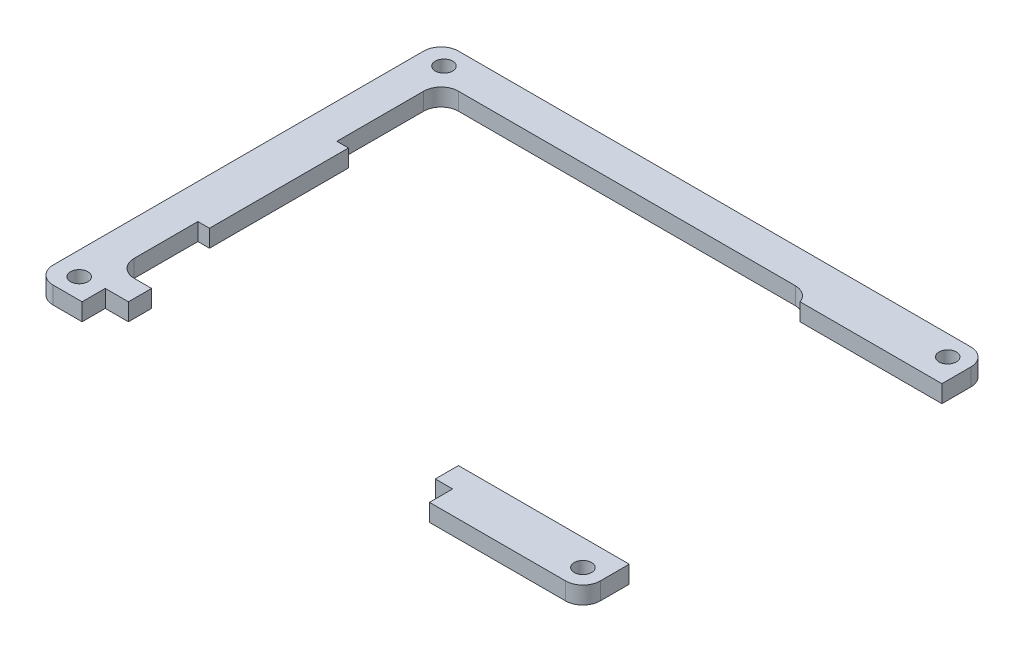
ISO-10303-21;
HEADER;
FILE_DESCRIPTION(('STEP AP214'),'2;1');
FILE_NAME('part.step','',(''),(''),'','','');
FILE_SCHEMA(('AUTOMOTIVE_DESIGN { 1 0 10303 214 1 1 1 1 }'));
ENDSEC;
DATA;
#1=APPLICATION_CONTEXT('core data for automotive mechanical design processes');
#2=APPLICATION_PROTOCOL_DEFINITION('international standard','automotive_design',2000,#1);
#3=PRODUCT_CONTEXT('',#1,'mechanical');
#4=PRODUCT('Part','Part','',(#3));
#5=PRODUCT_RELATED_PRODUCT_CATEGORY('part','',(#4));
#6=PRODUCT_DEFINITION_FORMATION('','',#4);
#7=PRODUCT_DEFINITION_CONTEXT('part definition',#1,'design');
#8=PRODUCT_DEFINITION('design','',#6,#7);
#9=PRODUCT_DEFINITION_SHAPE('','',#8);
#10=(LENGTH_UNIT() NAMED_UNIT(*) SI_UNIT(.MILLI.,.METRE.));
#11=(NAMED_UNIT(*) PLANE_ANGLE_UNIT() SI_UNIT($,.RADIAN.));
#12=(NAMED_UNIT(*) SI_UNIT($,.STERADIAN.) SOLID_ANGLE_UNIT());
#13=UNCERTAINTY_MEASURE_WITH_UNIT(LENGTH_MEASURE(1.E-05),#10,'distance_accuracy_value','');
#14=(GEOMETRIC_REPRESENTATION_CONTEXT(3) GLOBAL_UNCERTAINTY_ASSIGNED_CONTEXT((#13)) GLOBAL_UNIT_ASSIGNED_CONTEXT((#10,
#11,#12)) REPRESENTATION_CONTEXT('',''));
#15=CARTESIAN_POINT('',(0.,0.,0.));
#16=DIRECTION('',(0.,0.,1.));
#17=DIRECTION('',(1.,0.,0.));
#18=AXIS2_PLACEMENT_3D('',#15,#16,#17);
#19=CARTESIAN_POINT('',(47.25,3.,-35.));
#20=DIRECTION('',(-1.,0.,0.));
#21=DIRECTION('',(0.,0.,1.));
#22=AXIS2_PLACEMENT_3D('',#19,#20,#21);
#23=PLANE('',#22);
#24=DIRECTION('',(0.,1.,0.));
#25=VECTOR('',#24,1.);
#26=CARTESIAN_POINT('',(47.25,0.,27.));
#27=LINE('',#26,#25);
#28=CARTESIAN_POINT('',(47.25,0.,27.));
#29=VERTEX_POINT('',#28);
#30=CARTESIAN_POINT('',(47.25,3.,27.));
#31=VERTEX_POINT('',#30);
#32=EDGE_CURVE('E129',#29,#31,#27,.T.);
#33=ORIENTED_EDGE('',*,*,#32,.T.);
#34=DIRECTION('',(0.,0.,-1.));
#35=VECTOR('',#34,1.);
#36=CARTESIAN_POINT('',(47.25,3.,-35.));
#37=LINE('',#36,#35);
#38=CARTESIAN_POINT('',(47.25,3.,32.));
#39=VERTEX_POINT('',#38);
#40=EDGE_CURVE('E114',#39,#31,#37,.T.);
#41=ORIENTED_EDGE('',*,*,#40,.F.);
#42=DIRECTION('',(0.,-1.,0.));
#43=VECTOR('',#42,1.);
#44=CARTESIAN_POINT('',(47.25,3.,32.));
#45=LINE('',#44,#43);
#46=CARTESIAN_POINT('',(47.25,0.,32.));
#47=VERTEX_POINT('',#46);
#48=EDGE_CURVE('E127',#39,#47,#45,.T.);
#49=ORIENTED_EDGE('',*,*,#48,.T.);
#50=DIRECTION('',(0.,0.,-1.));
#51=VECTOR('',#50,1.);
#52=CARTESIAN_POINT('',(47.25,0.,-35.));
#53=LINE('',#52,#51);
#54=EDGE_CURVE('E135',#47,#29,#53,.T.);
#55=ORIENTED_EDGE('',*,*,#54,.T.);
#56=EDGE_LOOP('',(#33,#41,#49,#55));
#57=FACE_BOUND('',#56,.T.);
#58=ADVANCED_FACE('F49',(#57),#23,.F.);
#59=CARTESIAN_POINT('',(-47.25,3.,35.));
#60=DIRECTION('',(0.,0.,-1.));
#61=DIRECTION('',(-1.,0.,0.));
#62=AXIS2_PLACEMENT_3D('',#59,#60,#61);
#63=PLANE('',#62);
#64=DIRECTION('',(1.,0.,0.));
#65=VECTOR('',#64,1.);
#66=CARTESIAN_POINT('',(-47.25,3.,35.));
#67=LINE('',#66,#65);
#68=CARTESIAN_POINT('',(20.75,3.,35.));
#69=VERTEX_POINT('',#68);
#70=CARTESIAN_POINT('',(44.25,3.,35.));
#71=VERTEX_POINT('',#70);
#72=EDGE_CURVE('E116',#69,#71,#67,.T.);
#73=ORIENTED_EDGE('',*,*,#72,.F.);
#74=DIRECTION('',(0.,1.,0.));
#75=VECTOR('',#74,1.);
#76=CARTESIAN_POINT('',(20.75,0.,35.));
#77=LINE('',#76,#75);
#78=CARTESIAN_POINT('',(20.75,0.,35.));
#79=VERTEX_POINT('',#78);
#80=EDGE_CURVE('E12',#79,#69,#77,.T.);
#81=ORIENTED_EDGE('',*,*,#80,.F.);
#82=DIRECTION('',(1.,0.,0.));
#83=VECTOR('',#82,1.);
#84=CARTESIAN_POINT('',(-47.25,0.,35.));
#85=LINE('',#84,#83);
#86=CARTESIAN_POINT('',(44.25,0.,35.));
#87=VERTEX_POINT('',#86);
#88=EDGE_CURVE('E137',#79,#87,#85,.T.);
#89=ORIENTED_EDGE('',*,*,#88,.T.);
#90=DIRECTION('',(0.,-1.,0.));
#91=VECTOR('',#90,1.);
#92=CARTESIAN_POINT('',(44.25,3.,35.));
#93=LINE('',#92,#91);
#94=EDGE_CURVE('E130',#87,#71,#93,.F.);
#95=ORIENTED_EDGE('',*,*,#94,.T.);
#96=EDGE_LOOP('',(#73,#81,#89,#95));
#97=FACE_BOUND('',#96,.T.);
#98=ADVANCED_FACE('F183',(#97),#63,.F.);
#99=CARTESIAN_POINT('',(0.,3.,0.));
#100=DIRECTION('',(0.,1.,0.));
#101=DIRECTION('',(0.,0.,1.));
#102=AXIS2_PLACEMENT_3D('',#99,#100,#101);
#103=PLANE('',#102);
#104=CARTESIAN_POINT('',(43.75,3.,31.5));
#105=DIRECTION('',(0.,1.,0.));
#106=DIRECTION('',(0.,0.,1.));
#107=AXIS2_PLACEMENT_3D('',#104,#105,#106);
#108=CIRCLE('',#107,1.5);
#109=CARTESIAN_POINT('',(43.75,3.,33.));
#110=VERTEX_POINT('',#109);
#111=EDGE_CURVE('E144',#110,#110,#108,.T.);
#112=ORIENTED_EDGE('',*,*,#111,.F.);
#113=EDGE_LOOP('',(#112));
#114=FACE_BOUND('',#113,.T.);
#115=ORIENTED_EDGE('',*,*,#40,.T.);
#116=DIRECTION('',(-1.,0.,0.));
#117=VECTOR('',#116,1.);
#118=CARTESIAN_POINT('',(0.,3.,27.));
#119=LINE('',#118,#117);
#120=CARTESIAN_POINT('',(17.75,3.,27.));
#121=VERTEX_POINT('',#120);
#122=EDGE_CURVE('E53',#31,#121,#119,.T.);
#123=ORIENTED_EDGE('',*,*,#122,.T.);
#124=DIRECTION('',(0.,0.,-1.));
#125=VECTOR('',#124,1.);
#126=CARTESIAN_POINT('',(17.75,3.,0.));
#127=LINE('',#126,#125);
#128=CARTESIAN_POINT('',(17.75,3.,31.));
#129=VERTEX_POINT('',#128);
#130=EDGE_CURVE('E156',#129,#121,#127,.T.);
#131=ORIENTED_EDGE('',*,*,#130,.F.);
#132=DIRECTION('',(-1.,0.,0.));
#133=VECTOR('',#132,1.);
#134=CARTESIAN_POINT('',(0.,3.,31.));
#135=LINE('',#134,#133);
#136=CARTESIAN_POINT('',(20.75,3.,31.));
#137=VERTEX_POINT('',#136);
#138=EDGE_CURVE('E154',#137,#129,#135,.T.);
#139=ORIENTED_EDGE('',*,*,#138,.F.);
#140=DIRECTION('',(0.,0.,-1.));
#141=VECTOR('',#140,1.);
#142=CARTESIAN_POINT('',(20.75,3.,0.));
#143=LINE('',#142,#141);
#144=EDGE_CURVE('E59',#69,#137,#143,.T.);
#145=ORIENTED_EDGE('',*,*,#144,.F.);
#146=ORIENTED_EDGE('',*,*,#72,.T.);
#147=CARTESIAN_POINT('',(44.25,3.,32.));
#148=DIRECTION('',(0.,1.,0.));
#149=DIRECTION('',(0.,0.,1.));
#150=AXIS2_PLACEMENT_3D('',#147,#148,#149);
#151=CIRCLE('',#150,3.);
#152=EDGE_CURVE('E110',#71,#39,#151,.T.);
#153=ORIENTED_EDGE('',*,*,#152,.T.);
#154=EDGE_LOOP('',(#115,#123,#131,#139,#145,#146,#153));
#155=FACE_BOUND('',#154,.T.);
#156=ADVANCED_FACE('F112',(#114,#155),#103,.T.);
#157=CARTESIAN_POINT('',(0.,0.,0.));
#158=DIRECTION('',(0.,1.,0.));
#159=DIRECTION('',(0.,0.,1.));
#160=AXIS2_PLACEMENT_3D('',#157,#158,#159);
#161=PLANE('',#160);
#162=CARTESIAN_POINT('',(43.75,0.,31.5));
#163=DIRECTION('',(0.,1.,0.));
#164=DIRECTION('',(0.,0.,1.));
#165=AXIS2_PLACEMENT_3D('',#162,#163,#164);
#166=CIRCLE('',#165,1.5);
#167=CARTESIAN_POINT('',(43.75,0.,33.));
#168=VERTEX_POINT('',#167);
#169=EDGE_CURVE('E121',#168,#168,#166,.T.);
#170=ORIENTED_EDGE('',*,*,#169,.T.);
#171=EDGE_LOOP('',(#170));
#172=FACE_BOUND('',#171,.T.);
#173=DIRECTION('',(-1.,0.,0.));
#174=VECTOR('',#173,1.);
#175=CARTESIAN_POINT('',(0.,0.,27.));
#176=LINE('',#175,#174);
#177=CARTESIAN_POINT('',(17.75,0.,27.));
#178=VERTEX_POINT('',#177);
#179=EDGE_CURVE('E147',#29,#178,#176,.T.);
#180=ORIENTED_EDGE('',*,*,#179,.F.);
#181=ORIENTED_EDGE('',*,*,#54,.F.);
#182=CARTESIAN_POINT('',(44.25,0.,32.));
#183=DIRECTION('',(0.,1.,0.));
#184=DIRECTION('',(0.,0.,1.));
#185=AXIS2_PLACEMENT_3D('',#182,#183,#184);
#186=CIRCLE('',#185,3.);
#187=EDGE_CURVE('E134',#47,#87,#186,.F.);
#188=ORIENTED_EDGE('',*,*,#187,.T.);
#189=ORIENTED_EDGE('',*,*,#88,.F.);
#190=DIRECTION('',(0.,0.,-1.));
#191=VECTOR('',#190,1.);
#192=CARTESIAN_POINT('',(20.75,0.,0.));
#193=LINE('',#192,#191);
#194=CARTESIAN_POINT('',(20.75,0.,31.));
#195=VERTEX_POINT('',#194);
#196=EDGE_CURVE('E142',#79,#195,#193,.T.);
#197=ORIENTED_EDGE('',*,*,#196,.T.);
#198=DIRECTION('',(-1.,0.,0.));
#199=VECTOR('',#198,1.);
#200=CARTESIAN_POINT('',(0.,0.,31.));
#201=LINE('',#200,#199);
#202=CARTESIAN_POINT('',(17.75,0.,31.));
#203=VERTEX_POINT('',#202);
#204=EDGE_CURVE('E164',#195,#203,#201,.T.);
#205=ORIENTED_EDGE('',*,*,#204,.T.);
#206=DIRECTION('',(0.,0.,-1.));
#207=VECTOR('',#206,1.);
#208=CARTESIAN_POINT('',(17.75,0.,0.));
#209=LINE('',#208,#207);
#210=EDGE_CURVE('E148',#203,#178,#209,.T.);
#211=ORIENTED_EDGE('',*,*,#210,.T.);
#212=EDGE_LOOP('',(#180,#181,#188,#189,#197,#205,#211));
#213=FACE_BOUND('',#212,.T.);
#214=ADVANCED_FACE('F176',(#172,#213),#161,.F.);
#215=CARTESIAN_POINT('',(43.75,0.,31.5));
#216=DIRECTION('',(0.,1.,0.));
#217=DIRECTION('',(0.,0.,1.));
#218=AXIS2_PLACEMENT_3D('',#215,#216,#217);
#219=CYLINDRICAL_SURFACE('',#218,1.5);
#220=ORIENTED_EDGE('',*,*,#169,.F.);
#221=EDGE_LOOP('',(#220));
#222=FACE_BOUND('',#221,.T.);
#223=ORIENTED_EDGE('',*,*,#111,.T.);
#224=EDGE_LOOP('',(#223));
#225=FACE_BOUND('',#224,.T.);
#226=ADVANCED_FACE('F194',(#222,#225),#219,.F.);
#227=CARTESIAN_POINT('',(44.25,3.,32.));
#228=DIRECTION('',(0.,-1.,0.));
#229=DIRECTION('',(0.,0.,-1.));
#230=AXIS2_PLACEMENT_3D('',#227,#228,#229);
#231=CYLINDRICAL_SURFACE('',#230,3.);
#232=ORIENTED_EDGE('',*,*,#152,.F.);
#233=ORIENTED_EDGE('',*,*,#94,.F.);
#234=ORIENTED_EDGE('',*,*,#187,.F.);
#235=ORIENTED_EDGE('',*,*,#48,.F.);
#236=EDGE_LOOP('',(#232,#233,#234,#235));
#237=FACE_BOUND('',#236,.T.);
#238=ADVANCED_FACE('F132',(#237),#231,.T.);
#239=CARTESIAN_POINT('',(0.,0.,27.));
#240=DIRECTION('',(0.,0.,-1.));
#241=DIRECTION('',(-1.,0.,0.));
#242=AXIS2_PLACEMENT_3D('',#239,#240,#241);
#243=PLANE('',#242);
#244=ORIENTED_EDGE('',*,*,#122,.F.);
#245=ORIENTED_EDGE('',*,*,#32,.F.);
#246=ORIENTED_EDGE('',*,*,#179,.T.);
#247=DIRECTION('',(0.,1.,0.));
#248=VECTOR('',#247,1.);
#249=CARTESIAN_POINT('',(17.75,0.,27.));
#250=LINE('',#249,#248);
#251=EDGE_CURVE('E157',#178,#121,#250,.T.);
#252=ORIENTED_EDGE('',*,*,#251,.T.);
#253=EDGE_LOOP('',(#244,#245,#246,#252));
#254=FACE_BOUND('',#253,.T.);
#255=ADVANCED_FACE('F51',(#254),#243,.T.);
#256=CARTESIAN_POINT('',(17.75,0.,0.));
#257=DIRECTION('',(1.,0.,0.));
#258=DIRECTION('',(0.,0.,-1.));
#259=AXIS2_PLACEMENT_3D('',#256,#257,#258);
#260=PLANE('',#259);
#261=ORIENTED_EDGE('',*,*,#130,.T.);
#262=ORIENTED_EDGE('',*,*,#251,.F.);
#263=ORIENTED_EDGE('',*,*,#210,.F.);
#264=DIRECTION('',(0.,1.,0.));
#265=VECTOR('',#264,1.);
#266=CARTESIAN_POINT('',(17.75,0.,31.));
#267=LINE('',#266,#265);
#268=EDGE_CURVE('E86',#203,#129,#267,.T.);
#269=ORIENTED_EDGE('',*,*,#268,.T.);
#270=EDGE_LOOP('',(#261,#262,#263,#269));
#271=FACE_BOUND('',#270,.T.);
#272=ADVANCED_FACE('F174',(#271),#260,.F.);
#273=CARTESIAN_POINT('',(0.,0.,31.));
#274=DIRECTION('',(0.,0.,-1.));
#275=DIRECTION('',(-1.,0.,0.));
#276=AXIS2_PLACEMENT_3D('',#273,#274,#275);
#277=PLANE('',#276);
#278=ORIENTED_EDGE('',*,*,#138,.T.);
#279=ORIENTED_EDGE('',*,*,#268,.F.);
#280=ORIENTED_EDGE('',*,*,#204,.F.);
#281=DIRECTION('',(0.,1.,0.));
#282=VECTOR('',#281,1.);
#283=CARTESIAN_POINT('',(20.75,0.,31.));
#284=LINE('',#283,#282);
#285=EDGE_CURVE('E151',#195,#137,#284,.T.);
#286=ORIENTED_EDGE('',*,*,#285,.T.);
#287=EDGE_LOOP('',(#278,#279,#280,#286));
#288=FACE_BOUND('',#287,.T.);
#289=ADVANCED_FACE('F179',(#288),#277,.F.);
#290=CARTESIAN_POINT('',(20.75,0.,0.));
#291=DIRECTION('',(1.,0.,0.));
#292=DIRECTION('',(0.,0.,-1.));
#293=AXIS2_PLACEMENT_3D('',#290,#291,#292);
#294=PLANE('',#293);
#295=ORIENTED_EDGE('',*,*,#144,.T.);
#296=ORIENTED_EDGE('',*,*,#285,.F.);
#297=ORIENTED_EDGE('',*,*,#196,.F.);
#298=ORIENTED_EDGE('',*,*,#80,.T.);
#299=EDGE_LOOP('',(#295,#296,#297,#298));
#300=FACE_BOUND('',#299,.T.);
#301=ADVANCED_FACE('F180',(#300),#294,.F.);
#302=CLOSED_SHELL('',(#58,#98,#156,#214,#226,#238,#255,#272,#289,#301));
#303=MANIFOLD_SOLID_BREP('B2',#302);
#304=CARTESIAN_POINT('',(43.75,0.,-31.5));
#305=DIRECTION('',(0.,1.,0.));
#306=DIRECTION('',(0.,0.,1.));
#307=AXIS2_PLACEMENT_3D('',#304,#305,#306);
#308=CYLINDRICAL_SURFACE('',#307,1.5);
#309=CARTESIAN_POINT('',(43.75,0.,-31.5));
#310=DIRECTION('',(0.,1.,0.));
#311=DIRECTION('',(0.,0.,1.));
#312=AXIS2_PLACEMENT_3D('',#309,#310,#311);
#313=CIRCLE('',#312,1.5);
#314=CARTESIAN_POINT('',(43.75,0.,-30.));
#315=VERTEX_POINT('',#314);
#316=EDGE_CURVE('E560',#315,#315,#313,.T.);
#317=ORIENTED_EDGE('',*,*,#316,.F.);
#318=EDGE_LOOP('',(#317));
#319=FACE_BOUND('',#318,.T.);
#320=CARTESIAN_POINT('',(43.75,3.,-31.5));
#321=DIRECTION('',(0.,1.,0.));
#322=DIRECTION('',(0.,0.,1.));
#323=AXIS2_PLACEMENT_3D('',#320,#321,#322);
#324=CIRCLE('',#323,1.5);
#325=CARTESIAN_POINT('',(43.75,3.,-30.));
#326=VERTEX_POINT('',#325);
#327=EDGE_CURVE('E548',#326,#326,#324,.T.);
#328=ORIENTED_EDGE('',*,*,#327,.T.);
#329=EDGE_LOOP('',(#328));
#330=FACE_BOUND('',#329,.T.);
#331=ADVANCED_FACE('F275',(#319,#330),#308,.F.);
#332=CARTESIAN_POINT('',(-43.25,0.,-31.5));
#333=DIRECTION('',(0.,1.,0.));
#334=DIRECTION('',(0.,0.,1.));
#335=AXIS2_PLACEMENT_3D('',#332,#333,#334);
#336=CYLINDRICAL_SURFACE('',#335,1.5);
#337=CARTESIAN_POINT('',(-43.25,0.,-31.5));
#338=DIRECTION('',(0.,1.,0.));
#339=DIRECTION('',(0.,0.,1.));
#340=AXIS2_PLACEMENT_3D('',#337,#338,#339);
#341=CIRCLE('',#340,1.5);
#342=CARTESIAN_POINT('',(-43.25,0.,-30.));
#343=VERTEX_POINT('',#342);
#344=EDGE_CURVE('E544',#343,#343,#341,.T.);
#345=ORIENTED_EDGE('',*,*,#344,.F.);
#346=EDGE_LOOP('',(#345));
#347=FACE_BOUND('',#346,.T.);
#348=CARTESIAN_POINT('',(-43.25,3.,-31.5));
#349=DIRECTION('',(0.,1.,0.));
#350=DIRECTION('',(0.,0.,1.));
#351=AXIS2_PLACEMENT_3D('',#348,#349,#350);
#352=CIRCLE('',#351,1.5);
#353=CARTESIAN_POINT('',(-43.25,3.,-30.));
#354=VERTEX_POINT('',#353);
#355=EDGE_CURVE('E549',#354,#354,#352,.T.);
#356=ORIENTED_EDGE('',*,*,#355,.T.);
#357=EDGE_LOOP('',(#356));
#358=FACE_BOUND('',#357,.T.);
#359=ADVANCED_FACE('F752',(#347,#358),#336,.F.);
#360=CARTESIAN_POINT('',(-43.25,0.,31.5));
#361=DIRECTION('',(0.,1.,0.));
#362=DIRECTION('',(0.,0.,1.));
#363=AXIS2_PLACEMENT_3D('',#360,#361,#362);
#364=CYLINDRICAL_SURFACE('',#363,1.5);
#365=CARTESIAN_POINT('',(-43.25,0.,31.5));
#366=DIRECTION('',(0.,1.,0.));
#367=DIRECTION('',(0.,0.,1.));
#368=AXIS2_PLACEMENT_3D('',#365,#366,#367);
#369=CIRCLE('',#368,1.5);
#370=CARTESIAN_POINT('',(-43.25,0.,33.));
#371=VERTEX_POINT('',#370);
#372=EDGE_CURVE('E553',#371,#371,#369,.T.);
#373=ORIENTED_EDGE('',*,*,#372,.F.);
#374=EDGE_LOOP('',(#373));
#375=FACE_BOUND('',#374,.T.);
#376=CARTESIAN_POINT('',(-43.25,3.,31.5));
#377=DIRECTION('',(0.,1.,0.));
#378=DIRECTION('',(0.,0.,1.));
#379=AXIS2_PLACEMENT_3D('',#376,#377,#378);
#380=CIRCLE('',#379,1.5);
#381=CARTESIAN_POINT('',(-43.25,3.,33.));
#382=VERTEX_POINT('',#381);
#383=EDGE_CURVE('E518',#382,#382,#380,.T.);
#384=ORIENTED_EDGE('',*,*,#383,.T.);
#385=EDGE_LOOP('',(#384));
#386=FACE_BOUND('',#385,.T.);
#387=ADVANCED_FACE('F758',(#375,#386),#364,.F.);
#388=CARTESIAN_POINT('',(44.25,3.,-32.));
#389=DIRECTION('',(0.,-1.,0.));
#390=DIRECTION('',(0.,0.,-1.));
#391=AXIS2_PLACEMENT_3D('',#388,#389,#390);
#392=CYLINDRICAL_SURFACE('',#391,3.);
#393=CARTESIAN_POINT('',(44.25,3.,-32.));
#394=DIRECTION('',(0.,1.,0.));
#395=DIRECTION('',(0.,0.,1.));
#396=AXIS2_PLACEMENT_3D('',#393,#394,#395);
#397=CIRCLE('',#396,3.);
#398=CARTESIAN_POINT('',(47.25,3.,-32.));
#399=VERTEX_POINT('',#398);
#400=CARTESIAN_POINT('',(44.25,3.,-35.));
#401=VERTEX_POINT('',#400);
#402=EDGE_CURVE('E618',#399,#401,#397,.T.);
#403=ORIENTED_EDGE('',*,*,#402,.F.);
#404=DIRECTION('',(0.,-1.,0.));
#405=VECTOR('',#404,1.);
#406=CARTESIAN_POINT('',(47.25,3.,-32.));
#407=LINE('',#406,#405);
#408=CARTESIAN_POINT('',(47.25,0.,-32.));
#409=VERTEX_POINT('',#408);
#410=EDGE_CURVE('E634',#409,#399,#407,.F.);
#411=ORIENTED_EDGE('',*,*,#410,.F.);
#412=CARTESIAN_POINT('',(44.25,0.,-32.));
#413=DIRECTION('',(0.,1.,0.));
#414=DIRECTION('',(0.,0.,1.));
#415=AXIS2_PLACEMENT_3D('',#412,#413,#414);
#416=CIRCLE('',#415,3.);
#417=CARTESIAN_POINT('',(44.25,0.,-35.));
#418=VERTEX_POINT('',#417);
#419=EDGE_CURVE('E601',#418,#409,#416,.F.);
#420=ORIENTED_EDGE('',*,*,#419,.F.);
#421=DIRECTION('',(0.,-1.,0.));
#422=VECTOR('',#421,1.);
#423=CARTESIAN_POINT('',(44.25,3.,-35.));
#424=LINE('',#423,#422);
#425=EDGE_CURVE('E627',#401,#418,#424,.T.);
#426=ORIENTED_EDGE('',*,*,#425,.F.);
#427=EDGE_LOOP('',(#403,#411,#420,#426));
#428=FACE_BOUND('',#427,.T.);
#429=ADVANCED_FACE('F732',(#428),#392,.T.);
#430=CARTESIAN_POINT('',(-47.25,3.,-35.));
#431=DIRECTION('',(0.,0.,1.));
#432=DIRECTION('',(1.,0.,0.));
#433=AXIS2_PLACEMENT_3D('',#430,#431,#432);
#434=PLANE('',#433);
#435=DIRECTION('',(-1.,0.,0.));
#436=VECTOR('',#435,1.);
#437=CARTESIAN_POINT('',(-47.25,0.,-35.));
#438=LINE('',#437,#436);
#439=CARTESIAN_POINT('',(-44.25,0.,-35.));
#440=VERTEX_POINT('',#439);
#441=EDGE_CURVE('E587',#418,#440,#438,.T.);
#442=ORIENTED_EDGE('',*,*,#441,.T.);
#443=DIRECTION('',(0.,-1.,0.));
#444=VECTOR('',#443,1.);
#445=CARTESIAN_POINT('',(-44.25,3.,-35.));
#446=LINE('',#445,#444);
#447=CARTESIAN_POINT('',(-44.25,3.,-35.));
#448=VERTEX_POINT('',#447);
#449=EDGE_CURVE('E631',#440,#448,#446,.F.);
#450=ORIENTED_EDGE('',*,*,#449,.T.);
#451=DIRECTION('',(-1.,0.,0.));
#452=VECTOR('',#451,1.);
#453=CARTESIAN_POINT('',(-47.25,3.,-35.));
#454=LINE('',#453,#452);
#455=EDGE_CURVE('E571',#401,#448,#454,.T.);
#456=ORIENTED_EDGE('',*,*,#455,.F.);
#457=ORIENTED_EDGE('',*,*,#425,.T.);
#458=EDGE_LOOP('',(#442,#450,#456,#457));
#459=FACE_BOUND('',#458,.T.);
#460=ADVANCED_FACE('F727',(#459),#434,.F.);
#461=CARTESIAN_POINT('',(-44.25,3.,-32.));
#462=DIRECTION('',(0.,-1.,0.));
#463=DIRECTION('',(0.,0.,-1.));
#464=AXIS2_PLACEMENT_3D('',#461,#462,#463);
#465=CYLINDRICAL_SURFACE('',#464,3.);
#466=CARTESIAN_POINT('',(-44.25,3.,-32.));
#467=DIRECTION('',(0.,1.,0.));
#468=DIRECTION('',(0.,0.,1.));
#469=AXIS2_PLACEMENT_3D('',#466,#467,#468);
#470=CIRCLE('',#469,3.);
#471=CARTESIAN_POINT('',(-47.25,3.,-32.));
#472=VERTEX_POINT('',#471);
#473=EDGE_CURVE('E621',#448,#472,#470,.T.);
#474=ORIENTED_EDGE('',*,*,#473,.F.);
#475=ORIENTED_EDGE('',*,*,#449,.F.);
#476=CARTESIAN_POINT('',(-44.25,0.,-32.));
#477=DIRECTION('',(0.,1.,0.));
#478=DIRECTION('',(0.,0.,1.));
#479=AXIS2_PLACEMENT_3D('',#476,#477,#478);
#480=CIRCLE('',#479,3.);
#481=CARTESIAN_POINT('',(-47.25,0.,-32.));
#482=VERTEX_POINT('',#481);
#483=EDGE_CURVE('E605',#482,#440,#480,.F.);
#484=ORIENTED_EDGE('',*,*,#483,.F.);
#485=DIRECTION('',(0.,-1.,0.));
#486=VECTOR('',#485,1.);
#487=CARTESIAN_POINT('',(-47.25,3.,-32.));
#488=LINE('',#487,#486);
#489=EDGE_CURVE('E611',#472,#482,#488,.T.);
#490=ORIENTED_EDGE('',*,*,#489,.F.);
#491=EDGE_LOOP('',(#474,#475,#484,#490));
#492=FACE_BOUND('',#491,.T.);
#493=ADVANCED_FACE('F723',(#492),#465,.T.);
#494=CARTESIAN_POINT('',(-47.25,3.,-35.));
#495=DIRECTION('',(1.,0.,0.));
#496=DIRECTION('',(0.,0.,-1.));
#497=AXIS2_PLACEMENT_3D('',#494,#495,#496);
#498=PLANE('',#497);
#499=DIRECTION('',(0.,0.,1.));
#500=VECTOR('',#499,1.);
#501=CARTESIAN_POINT('',(-47.25,0.,-35.));
#502=LINE('',#501,#500);
#503=CARTESIAN_POINT('',(-47.25,0.,32.));
#504=VERTEX_POINT('',#503);
#505=EDGE_CURVE('E591',#482,#504,#502,.T.);
#506=ORIENTED_EDGE('',*,*,#505,.T.);
#507=DIRECTION('',(0.,-1.,0.));
#508=VECTOR('',#507,1.);
#509=CARTESIAN_POINT('',(-47.25,3.,32.));
#510=LINE('',#509,#508);
#511=CARTESIAN_POINT('',(-47.25,3.,32.));
#512=VERTEX_POINT('',#511);
#513=EDGE_CURVE('E615',#504,#512,#510,.F.);
#514=ORIENTED_EDGE('',*,*,#513,.T.);
#515=DIRECTION('',(0.,0.,1.));
#516=VECTOR('',#515,1.);
#517=CARTESIAN_POINT('',(-47.25,3.,-35.));
#518=LINE('',#517,#516);
#519=EDGE_CURVE('E576',#472,#512,#518,.T.);
#520=ORIENTED_EDGE('',*,*,#519,.F.);
#521=ORIENTED_EDGE('',*,*,#489,.T.);
#522=EDGE_LOOP('',(#506,#514,#520,#521));
#523=FACE_BOUND('',#522,.T.);
#524=ADVANCED_FACE('F719',(#523),#498,.F.);
#525=CARTESIAN_POINT('',(-44.25,3.,32.));
#526=DIRECTION('',(0.,-1.,0.));
#527=DIRECTION('',(0.,0.,-1.));
#528=AXIS2_PLACEMENT_3D('',#525,#526,#527);
#529=CYLINDRICAL_SURFACE('',#528,3.);
#530=CARTESIAN_POINT('',(-44.25,3.,32.));
#531=DIRECTION('',(0.,1.,0.));
#532=DIRECTION('',(0.,0.,1.));
#533=AXIS2_PLACEMENT_3D('',#530,#531,#532);
#534=CIRCLE('',#533,3.);
#535=CARTESIAN_POINT('',(-44.25,3.,35.));
#536=VERTEX_POINT('',#535);
#537=EDGE_CURVE('E624',#512,#536,#534,.T.);
#538=ORIENTED_EDGE('',*,*,#537,.F.);
#539=ORIENTED_EDGE('',*,*,#513,.F.);
#540=CARTESIAN_POINT('',(-44.25,0.,32.));
#541=DIRECTION('',(0.,1.,0.));
#542=DIRECTION('',(0.,0.,1.));
#543=AXIS2_PLACEMENT_3D('',#540,#541,#542);
#544=CIRCLE('',#543,3.);
#545=CARTESIAN_POINT('',(-44.25,0.,35.));
#546=VERTEX_POINT('',#545);
#547=EDGE_CURVE('E608',#546,#504,#544,.F.);
#548=ORIENTED_EDGE('',*,*,#547,.F.);
#549=DIRECTION('',(0.,-1.,0.));
#550=VECTOR('',#549,1.);
#551=CARTESIAN_POINT('',(-44.25,3.,35.));
#552=LINE('',#551,#550);
#553=EDGE_CURVE('E584',#536,#546,#552,.T.);
#554=ORIENTED_EDGE('',*,*,#553,.F.);
#555=EDGE_LOOP('',(#538,#539,#548,#554));
#556=FACE_BOUND('',#555,.T.);
#557=ADVANCED_FACE('F716',(#556),#529,.T.);
#558=CARTESIAN_POINT('',(0.,3.,0.));
#559=DIRECTION('',(0.,1.,0.));
#560=DIRECTION('',(0.,0.,1.));
#561=AXIS2_PLACEMENT_3D('',#558,#559,#560);
#562=PLANE('',#561);
#563=DIRECTION('',(-1.,0.,0.));
#564=VECTOR('',#563,1.);
#565=CARTESIAN_POINT('',(0.,3.,-27.));
#566=LINE('',#565,#564);
#567=CARTESIAN_POINT('',(47.25,3.,-27.));
#568=VERTEX_POINT('',#567);
#569=CARTESIAN_POINT('',(22.75,3.,-27.));
#570=VERTEX_POINT('',#569);
#571=EDGE_CURVE('E507',#568,#570,#566,.T.);
#572=ORIENTED_EDGE('',*,*,#571,.F.);
#573=DIRECTION('',(0.,0.,-1.));
#574=VECTOR('',#573,1.);
#575=CARTESIAN_POINT('',(47.25,3.,-35.));
#576=LINE('',#575,#574);
#577=EDGE_CURVE('E568',#568,#399,#576,.T.);
#578=ORIENTED_EDGE('',*,*,#577,.T.);
#579=ORIENTED_EDGE('',*,*,#402,.T.);
#580=ORIENTED_EDGE('',*,*,#455,.T.);
#581=ORIENTED_EDGE('',*,*,#473,.T.);
#582=ORIENTED_EDGE('',*,*,#519,.T.);
#583=ORIENTED_EDGE('',*,*,#537,.T.);
#584=DIRECTION('',(1.,0.,0.));
#585=VECTOR('',#584,1.);
#586=CARTESIAN_POINT('',(-47.25,3.,35.));
#587=LINE('',#586,#585);
#588=CARTESIAN_POINT('',(-39.25,3.,35.));
#589=VERTEX_POINT('',#588);
#590=EDGE_CURVE('E580',#536,#589,#587,.T.);
#591=ORIENTED_EDGE('',*,*,#590,.T.);
#592=DIRECTION('',(0.,0.,1.));
#593=VECTOR('',#592,1.);
#594=CARTESIAN_POINT('',(-39.25,3.,0.));
#595=LINE('',#594,#593);
#596=CARTESIAN_POINT('',(-39.25,3.,31.));
#597=VERTEX_POINT('',#596);
#598=EDGE_CURVE('E504',#597,#589,#595,.T.);
#599=ORIENTED_EDGE('',*,*,#598,.F.);
#600=DIRECTION('',(-1.,0.,0.));
#601=VECTOR('',#600,1.);
#602=CARTESIAN_POINT('',(0.,3.,31.));
#603=LINE('',#602,#601);
#604=CARTESIAN_POINT('',(-35.25,3.,31.));
#605=VERTEX_POINT('',#604);
#606=EDGE_CURVE('E500',#605,#597,#603,.T.);
#607=ORIENTED_EDGE('',*,*,#606,.F.);
#608=DIRECTION('',(0.,0.,1.));
#609=VECTOR('',#608,1.);
#610=CARTESIAN_POINT('',(-35.2500000000001,3.,0.));
#611=LINE('',#610,#609);
#612=CARTESIAN_POINT('',(-35.25,3.,27.));
#613=VERTEX_POINT('',#612);
#614=EDGE_CURVE('E496',#613,#605,#611,.T.);
#615=ORIENTED_EDGE('',*,*,#614,.F.);
#616=DIRECTION('',(-1.,0.,0.));
#617=VECTOR('',#616,1.);
#618=CARTESIAN_POINT('',(0.,3.,27.));
#619=LINE('',#618,#617);
#620=CARTESIAN_POINT('',(-38.25,3.,27.));
#621=VERTEX_POINT('',#620);
#622=EDGE_CURVE('E492',#613,#621,#619,.T.);
#623=ORIENTED_EDGE('',*,*,#622,.T.);
#624=CARTESIAN_POINT('',(-38.25,3.,24.));
#625=DIRECTION('',(0.,1.,0.));
#626=DIRECTION('',(0.,0.,1.));
#627=AXIS2_PLACEMENT_3D('',#624,#625,#626);
#628=CIRCLE('',#627,3.);
#629=CARTESIAN_POINT('',(-41.25,3.,24.));
#630=VERTEX_POINT('',#629);
#631=EDGE_CURVE('E661',#621,#630,#628,.F.);
#632=ORIENTED_EDGE('',*,*,#631,.T.);
#633=DIRECTION('',(0.,0.,-1.));
#634=VECTOR('',#633,1.);
#635=CARTESIAN_POINT('',(-41.25,3.,0.));
#636=LINE('',#635,#634);
#637=CARTESIAN_POINT('',(-41.25,3.,13.));
#638=VERTEX_POINT('',#637);
#639=EDGE_CURVE('E489',#630,#638,#636,.T.);
#640=ORIENTED_EDGE('',*,*,#639,.T.);
#641=DIRECTION('',(-1.,0.,0.));
#642=VECTOR('',#641,1.);
#643=CARTESIAN_POINT('',(0.,3.,13.));
#644=LINE('',#643,#642);
#645=CARTESIAN_POINT('',(-39.25,3.,13.));
#646=VERTEX_POINT('',#645);
#647=EDGE_CURVE('E486',#646,#638,#644,.T.);
#648=ORIENTED_EDGE('',*,*,#647,.F.);
#649=DIRECTION('',(0.,0.,1.));
#650=VECTOR('',#649,1.);
#651=CARTESIAN_POINT('',(-39.25,3.,0.));
#652=LINE('',#651,#650);
#653=CARTESIAN_POINT('',(-39.25,3.,-11.));
#654=VERTEX_POINT('',#653);
#655=EDGE_CURVE('E426',#654,#646,#652,.T.);
#656=ORIENTED_EDGE('',*,*,#655,.F.);
#657=DIRECTION('',(1.,0.,0.));
#658=VECTOR('',#657,1.);
#659=CARTESIAN_POINT('',(0.,3.,-11.));
#660=LINE('',#659,#658);
#661=CARTESIAN_POINT('',(-41.25,3.,-11.));
#662=VERTEX_POINT('',#661);
#663=EDGE_CURVE('E448',#662,#654,#660,.T.);
#664=ORIENTED_EDGE('',*,*,#663,.F.);
#665=CARTESIAN_POINT('',(-41.25,3.,-26.));
#666=VERTEX_POINT('',#665);
#667=EDGE_CURVE('E452',#662,#666,#636,.T.);
#668=ORIENTED_EDGE('',*,*,#667,.T.);
#669=CARTESIAN_POINT('',(-38.25,3.,-26.));
#670=DIRECTION('',(0.,1.,0.));
#671=DIRECTION('',(0.,0.,1.));
#672=AXIS2_PLACEMENT_3D('',#669,#670,#671);
#673=CIRCLE('',#672,3.);
#674=CARTESIAN_POINT('',(-38.25,3.,-29.));
#675=VERTEX_POINT('',#674);
#676=EDGE_CURVE('E284',#666,#675,#673,.F.);
#677=ORIENTED_EDGE('',*,*,#676,.T.);
#678=DIRECTION('',(1.,0.,0.));
#679=VECTOR('',#678,1.);
#680=CARTESIAN_POINT('',(0.,3.,-29.));
#681=LINE('',#680,#679);
#682=CARTESIAN_POINT('',(19.9215728752538,3.,-29.));
#683=VERTEX_POINT('',#682);
#684=EDGE_CURVE('E511',#675,#683,#681,.T.);
#685=ORIENTED_EDGE('',*,*,#684,.T.);
#686=CARTESIAN_POINT('',(19.9215728752538,3.,-26.));
#687=DIRECTION('',(0.,1.,0.));
#688=DIRECTION('',(0.,0.,1.));
#689=AXIS2_PLACEMENT_3D('',#686,#687,#688);
#690=CIRCLE('',#689,3.);
#691=EDGE_CURVE('E655',#683,#570,#690,.F.);
#692=ORIENTED_EDGE('',*,*,#691,.T.);
#693=EDGE_LOOP('',(#572,#578,#579,#580,#581,#582,#583,#591,#599,#607,#615,#623,#632,#640,#648,
#656,#664,#668,#677,#685,#692));
#694=FACE_BOUND('',#693,.T.);
#695=ORIENTED_EDGE('',*,*,#383,.F.);
#696=EDGE_LOOP('',(#695));
#697=FACE_BOUND('',#696,.T.);
#698=ORIENTED_EDGE('',*,*,#355,.F.);
#699=EDGE_LOOP('',(#698));
#700=FACE_BOUND('',#699,.T.);
#701=ORIENTED_EDGE('',*,*,#327,.F.);
#702=EDGE_LOOP('',(#701));
#703=FACE_BOUND('',#702,.T.);
#704=ADVANCED_FACE('F671',(#694,#697,#700,#703),#562,.T.);
#705=CARTESIAN_POINT('',(0.,0.,0.));
#706=DIRECTION('',(0.,1.,0.));
#707=DIRECTION('',(0.,0.,1.));
#708=AXIS2_PLACEMENT_3D('',#705,#706,#707);
#709=PLANE('',#708);
#710=DIRECTION('',(0.,0.,-1.));
#711=VECTOR('',#710,1.);
#712=CARTESIAN_POINT('',(47.25,0.,-35.));
#713=LINE('',#712,#711);
#714=CARTESIAN_POINT('',(47.25,0.,-27.));
#715=VERTEX_POINT('',#714);
#716=EDGE_CURVE('E564',#715,#409,#713,.T.);
#717=ORIENTED_EDGE('',*,*,#716,.F.);
#718=DIRECTION('',(-1.,0.,0.));
#719=VECTOR('',#718,1.);
#720=CARTESIAN_POINT('',(0.,0.,-27.));
#721=LINE('',#720,#719);
#722=CARTESIAN_POINT('',(22.75,0.,-27.));
#723=VERTEX_POINT('',#722);
#724=EDGE_CURVE('E474',#715,#723,#721,.T.);
#725=ORIENTED_EDGE('',*,*,#724,.T.);
#726=CARTESIAN_POINT('',(19.9215728752538,0.,-26.));
#727=DIRECTION('',(0.,1.,0.));
#728=DIRECTION('',(0.,0.,1.));
#729=AXIS2_PLACEMENT_3D('',#726,#727,#728);
#730=CIRCLE('',#729,3.);
#731=CARTESIAN_POINT('',(19.9215728752538,0.,-29.));
#732=VERTEX_POINT('',#731);
#733=EDGE_CURVE('E658',#723,#732,#730,.T.);
#734=ORIENTED_EDGE('',*,*,#733,.T.);
#735=DIRECTION('',(1.,0.,0.));
#736=VECTOR('',#735,1.);
#737=CARTESIAN_POINT('',(0.,0.,-29.));
#738=LINE('',#737,#736);
#739=CARTESIAN_POINT('',(-38.25,0.,-29.));
#740=VERTEX_POINT('',#739);
#741=EDGE_CURVE('E478',#740,#732,#738,.T.);
#742=ORIENTED_EDGE('',*,*,#741,.F.);
#743=CARTESIAN_POINT('',(-38.25,0.,-26.));
#744=DIRECTION('',(0.,1.,0.));
#745=DIRECTION('',(0.,0.,1.));
#746=AXIS2_PLACEMENT_3D('',#743,#744,#745);
#747=CIRCLE('',#746,3.);
#748=CARTESIAN_POINT('',(-41.25,0.,-26.));
#749=VERTEX_POINT('',#748);
#750=EDGE_CURVE('E47',#740,#749,#747,.T.);
#751=ORIENTED_EDGE('',*,*,#750,.T.);
#752=DIRECTION('',(0.,0.,-1.));
#753=VECTOR('',#752,1.);
#754=CARTESIAN_POINT('',(-41.25,0.,0.));
#755=LINE('',#754,#753);
#756=CARTESIAN_POINT('',(-41.25,0.,-11.));
#757=VERTEX_POINT('',#756);
#758=EDGE_CURVE('E458',#757,#749,#755,.T.);
#759=ORIENTED_EDGE('',*,*,#758,.F.);
#760=DIRECTION('',(1.,0.,0.));
#761=VECTOR('',#760,1.);
#762=CARTESIAN_POINT('',(0.,0.,-11.));
#763=LINE('',#762,#761);
#764=CARTESIAN_POINT('',(-39.25,0.,-11.));
#765=VERTEX_POINT('',#764);
#766=EDGE_CURVE('E432',#757,#765,#763,.T.);
#767=ORIENTED_EDGE('',*,*,#766,.T.);
#768=DIRECTION('',(0.,0.,1.));
#769=VECTOR('',#768,1.);
#770=CARTESIAN_POINT('',(-39.25,0.,0.));
#771=LINE('',#770,#769);
#772=CARTESIAN_POINT('',(-39.25,0.,13.));
#773=VERTEX_POINT('',#772);
#774=EDGE_CURVE('E423',#765,#773,#771,.T.);
#775=ORIENTED_EDGE('',*,*,#774,.T.);
#776=DIRECTION('',(-1.,0.,0.));
#777=VECTOR('',#776,1.);
#778=CARTESIAN_POINT('',(0.,0.,13.));
#779=LINE('',#778,#777);
#780=CARTESIAN_POINT('',(-41.25,0.,13.));
#781=VERTEX_POINT('',#780);
#782=EDGE_CURVE('E436',#773,#781,#779,.T.);
#783=ORIENTED_EDGE('',*,*,#782,.T.);
#784=CARTESIAN_POINT('',(-41.25,0.,24.));
#785=VERTEX_POINT('',#784);
#786=EDGE_CURVE('E441',#785,#781,#755,.T.);
#787=ORIENTED_EDGE('',*,*,#786,.F.);
#788=CARTESIAN_POINT('',(-38.25,0.,24.));
#789=DIRECTION('',(0.,1.,0.));
#790=DIRECTION('',(0.,0.,1.));
#791=AXIS2_PLACEMENT_3D('',#788,#789,#790);
#792=CIRCLE('',#791,3.);
#793=CARTESIAN_POINT('',(-38.25,0.,27.));
#794=VERTEX_POINT('',#793);
#795=EDGE_CURVE('E664',#785,#794,#792,.T.);
#796=ORIENTED_EDGE('',*,*,#795,.T.);
#797=DIRECTION('',(-1.,0.,0.));
#798=VECTOR('',#797,1.);
#799=CARTESIAN_POINT('',(0.,0.,27.));
#800=LINE('',#799,#798);
#801=CARTESIAN_POINT('',(-35.25,0.,27.));
#802=VERTEX_POINT('',#801);
#803=EDGE_CURVE('E457',#802,#794,#800,.T.);
#804=ORIENTED_EDGE('',*,*,#803,.F.);
#805=DIRECTION('',(0.,0.,1.));
#806=VECTOR('',#805,1.);
#807=CARTESIAN_POINT('',(-35.2500000000001,0.,0.));
#808=LINE('',#807,#806);
#809=CARTESIAN_POINT('',(-35.25,0.,31.));
#810=VERTEX_POINT('',#809);
#811=EDGE_CURVE('E462',#802,#810,#808,.T.);
#812=ORIENTED_EDGE('',*,*,#811,.T.);
#813=DIRECTION('',(-1.,0.,0.));
#814=VECTOR('',#813,1.);
#815=CARTESIAN_POINT('',(0.,0.,31.));
#816=LINE('',#815,#814);
#817=CARTESIAN_POINT('',(-39.25,0.,31.));
#818=VERTEX_POINT('',#817);
#819=EDGE_CURVE('E466',#810,#818,#816,.T.);
#820=ORIENTED_EDGE('',*,*,#819,.T.);
#821=DIRECTION('',(0.,0.,1.));
#822=VECTOR('',#821,1.);
#823=CARTESIAN_POINT('',(-39.25,0.,0.));
#824=LINE('',#823,#822);
#825=CARTESIAN_POINT('',(-39.25,0.,35.));
#826=VERTEX_POINT('',#825);
#827=EDGE_CURVE('E470',#818,#826,#824,.T.);
#828=ORIENTED_EDGE('',*,*,#827,.T.);
#829=DIRECTION('',(1.,0.,0.));
#830=VECTOR('',#829,1.);
#831=CARTESIAN_POINT('',(-47.25,0.,35.));
#832=LINE('',#831,#830);
#833=EDGE_CURVE('E572',#546,#826,#832,.T.);
#834=ORIENTED_EDGE('',*,*,#833,.F.);
#835=ORIENTED_EDGE('',*,*,#547,.T.);
#836=ORIENTED_EDGE('',*,*,#505,.F.);
#837=ORIENTED_EDGE('',*,*,#483,.T.);
#838=ORIENTED_EDGE('',*,*,#441,.F.);
#839=ORIENTED_EDGE('',*,*,#419,.T.);
#840=EDGE_LOOP('',(#717,#725,#734,#742,#751,#759,#767,#775,#783,#787,#796,#804,#812,#820,#828,
#834,#835,#836,#837,#838,#839));
#841=FACE_BOUND('',#840,.T.);
#842=ORIENTED_EDGE('',*,*,#372,.T.);
#843=EDGE_LOOP('',(#842));
#844=FACE_BOUND('',#843,.T.);
#845=ORIENTED_EDGE('',*,*,#344,.T.);
#846=EDGE_LOOP('',(#845));
#847=FACE_BOUND('',#846,.T.);
#848=ORIENTED_EDGE('',*,*,#316,.T.);
#849=EDGE_LOOP('',(#848));
#850=FACE_BOUND('',#849,.T.);
#851=ADVANCED_FACE('F444',(#841,#844,#847,#850),#709,.F.);
#852=CARTESIAN_POINT('',(-47.25,3.,35.));
#853=DIRECTION('',(0.,0.,-1.));
#854=DIRECTION('',(-1.,0.,0.));
#855=AXIS2_PLACEMENT_3D('',#852,#853,#854);
#856=PLANE('',#855);
#857=ORIENTED_EDGE('',*,*,#833,.T.);
#858=DIRECTION('',(0.,1.,0.));
#859=VECTOR('',#858,1.);
#860=CARTESIAN_POINT('',(-39.25,0.,35.));
#861=LINE('',#860,#859);
#862=EDGE_CURVE('E529',#826,#589,#861,.T.);
#863=ORIENTED_EDGE('',*,*,#862,.T.);
#864=ORIENTED_EDGE('',*,*,#590,.F.);
#865=ORIENTED_EDGE('',*,*,#553,.T.);
#866=EDGE_LOOP('',(#857,#863,#864,#865));
#867=FACE_BOUND('',#866,.T.);
#868=ADVANCED_FACE('F710',(#867),#856,.F.);
#869=CARTESIAN_POINT('',(47.25,3.,-35.));
#870=DIRECTION('',(-1.,0.,0.));
#871=DIRECTION('',(0.,0.,1.));
#872=AXIS2_PLACEMENT_3D('',#869,#870,#871);
#873=PLANE('',#872);
#874=ORIENTED_EDGE('',*,*,#577,.F.);
#875=DIRECTION('',(0.,1.,0.));
#876=VECTOR('',#875,1.);
#877=CARTESIAN_POINT('',(47.25,0.,-27.));
#878=LINE('',#877,#876);
#879=EDGE_CURVE('E526',#715,#568,#878,.T.);
#880=ORIENTED_EDGE('',*,*,#879,.F.);
#881=ORIENTED_EDGE('',*,*,#716,.T.);
#882=ORIENTED_EDGE('',*,*,#410,.T.);
#883=EDGE_LOOP('',(#874,#880,#881,#882));
#884=FACE_BOUND('',#883,.T.);
#885=ADVANCED_FACE('F738',(#884),#873,.F.);
#886=CARTESIAN_POINT('',(0.,0.,13.));
#887=DIRECTION('',(0.,0.,-1.));
#888=DIRECTION('',(-1.,0.,0.));
#889=AXIS2_PLACEMENT_3D('',#886,#887,#888);
#890=PLANE('',#889);
#891=ORIENTED_EDGE('',*,*,#647,.T.);
#892=DIRECTION('',(0.,1.,0.));
#893=VECTOR('',#892,1.);
#894=CARTESIAN_POINT('',(-41.25,0.,13.));
#895=LINE('',#894,#893);
#896=EDGE_CURVE('E431',#781,#638,#895,.T.);
#897=ORIENTED_EDGE('',*,*,#896,.F.);
#898=ORIENTED_EDGE('',*,*,#782,.F.);
#899=DIRECTION('',(0.,1.,0.));
#900=VECTOR('',#899,1.);
#901=CARTESIAN_POINT('',(-39.25,0.,13.));
#902=LINE('',#901,#900);
#903=EDGE_CURVE('E419',#773,#646,#902,.T.);
#904=ORIENTED_EDGE('',*,*,#903,.T.);
#905=EDGE_LOOP('',(#891,#897,#898,#904));
#906=FACE_BOUND('',#905,.T.);
#907=ADVANCED_FACE('F437',(#906),#890,.F.);
#908=CARTESIAN_POINT('',(-41.25,0.,0.));
#909=DIRECTION('',(1.,0.,0.));
#910=DIRECTION('',(0.,0.,-1.));
#911=AXIS2_PLACEMENT_3D('',#908,#909,#910);
#912=PLANE('',#911);
#913=ORIENTED_EDGE('',*,*,#639,.F.);
#914=DIRECTION('',(0.,1.,0.));
#915=VECTOR('',#914,1.);
#916=CARTESIAN_POINT('',(-41.25,0.,24.));
#917=LINE('',#916,#915);
#918=EDGE_CURVE('E649',#630,#785,#917,.F.);
#919=ORIENTED_EDGE('',*,*,#918,.T.);
#920=ORIENTED_EDGE('',*,*,#786,.T.);
#921=ORIENTED_EDGE('',*,*,#896,.T.);
#922=EDGE_LOOP('',(#913,#919,#920,#921));
#923=FACE_BOUND('',#922,.T.);
#924=ADVANCED_FACE('F686',(#923),#912,.T.);
#925=CARTESIAN_POINT('',(0.,0.,27.));
#926=DIRECTION('',(0.,0.,-1.));
#927=DIRECTION('',(-1.,0.,0.));
#928=AXIS2_PLACEMENT_3D('',#925,#926,#927);
#929=PLANE('',#928);
#930=ORIENTED_EDGE('',*,*,#803,.T.);
#931=DIRECTION('',(0.,1.,0.));
#932=VECTOR('',#931,1.);
#933=CARTESIAN_POINT('',(-38.25,3.,27.));
#934=LINE('',#933,#932);
#935=EDGE_CURVE('E645',#794,#621,#934,.T.);
#936=ORIENTED_EDGE('',*,*,#935,.T.);
#937=ORIENTED_EDGE('',*,*,#622,.F.);
#938=DIRECTION('',(0.,1.,0.));
#939=VECTOR('',#938,1.);
#940=CARTESIAN_POINT('',(-35.25,0.,27.));
#941=LINE('',#940,#939);
#942=EDGE_CURVE('E539',#802,#613,#941,.T.);
#943=ORIENTED_EDGE('',*,*,#942,.F.);
#944=EDGE_LOOP('',(#930,#936,#937,#943));
#945=FACE_BOUND('',#944,.T.);
#946=ADVANCED_FACE('F694',(#945),#929,.T.);
#947=CARTESIAN_POINT('',(-35.2500000000001,0.,0.));
#948=DIRECTION('',(-1.,0.,0.));
#949=DIRECTION('',(0.,0.,1.));
#950=AXIS2_PLACEMENT_3D('',#947,#948,#949);
#951=PLANE('',#950);
#952=ORIENTED_EDGE('',*,*,#614,.T.);
#953=DIRECTION('',(0.,1.,0.));
#954=VECTOR('',#953,1.);
#955=CARTESIAN_POINT('',(-35.25,0.,31.));
#956=LINE('',#955,#954);
#957=EDGE_CURVE('E536',#810,#605,#956,.T.);
#958=ORIENTED_EDGE('',*,*,#957,.F.);
#959=ORIENTED_EDGE('',*,*,#811,.F.);
#960=ORIENTED_EDGE('',*,*,#942,.T.);
#961=EDGE_LOOP('',(#952,#958,#959,#960));
#962=FACE_BOUND('',#961,.T.);
#963=ADVANCED_FACE('F699',(#962),#951,.F.);
#964=CARTESIAN_POINT('',(0.,0.,31.));
#965=DIRECTION('',(0.,0.,-1.));
#966=DIRECTION('',(-1.,0.,0.));
#967=AXIS2_PLACEMENT_3D('',#964,#965,#966);
#968=PLANE('',#967);
#969=ORIENTED_EDGE('',*,*,#606,.T.);
#970=DIRECTION('',(0.,1.,0.));
#971=VECTOR('',#970,1.);
#972=CARTESIAN_POINT('',(-39.25,0.,31.));
#973=LINE('',#972,#971);
#974=EDGE_CURVE('E533',#818,#597,#973,.T.);
#975=ORIENTED_EDGE('',*,*,#974,.F.);
#976=ORIENTED_EDGE('',*,*,#819,.F.);
#977=ORIENTED_EDGE('',*,*,#957,.T.);
#978=EDGE_LOOP('',(#969,#975,#976,#977));
#979=FACE_BOUND('',#978,.T.);
#980=ADVANCED_FACE('F705',(#979),#968,.F.);
#981=CARTESIAN_POINT('',(-39.25,0.,0.));
#982=DIRECTION('',(-1.,0.,0.));
#983=DIRECTION('',(0.,0.,1.));
#984=AXIS2_PLACEMENT_3D('',#981,#982,#983);
#985=PLANE('',#984);
#986=ORIENTED_EDGE('',*,*,#598,.T.);
#987=ORIENTED_EDGE('',*,*,#862,.F.);
#988=ORIENTED_EDGE('',*,*,#827,.F.);
#989=ORIENTED_EDGE('',*,*,#974,.T.);
#990=EDGE_LOOP('',(#986,#987,#988,#989));
#991=FACE_BOUND('',#990,.T.);
#992=ADVANCED_FACE('F707',(#991),#985,.F.);
#993=CARTESIAN_POINT('',(0.,0.,-27.));
#994=DIRECTION('',(0.,0.,-1.));
#995=DIRECTION('',(-1.,0.,0.));
#996=AXIS2_PLACEMENT_3D('',#993,#994,#995);
#997=PLANE('',#996);
#998=ORIENTED_EDGE('',*,*,#571,.T.);
#999=DIRECTION('',(0.,1.,0.));
#1000=VECTOR('',#999,1.);
#1001=CARTESIAN_POINT('',(22.75,0.,-27.));
#1002=LINE('',#1001,#1000);
#1003=EDGE_CURVE('E522',#723,#570,#1002,.T.);
#1004=ORIENTED_EDGE('',*,*,#1003,.F.);
#1005=ORIENTED_EDGE('',*,*,#724,.F.);
#1006=ORIENTED_EDGE('',*,*,#879,.T.);
#1007=EDGE_LOOP('',(#998,#1004,#1005,#1006));
#1008=FACE_BOUND('',#1007,.T.);
#1009=ADVANCED_FACE('F740',(#1008),#997,.F.);
#1010=CARTESIAN_POINT('',(0.,0.,-29.));
#1011=DIRECTION('',(0.,0.,1.));
#1012=DIRECTION('',(1.,0.,0.));
#1013=AXIS2_PLACEMENT_3D('',#1010,#1011,#1012);
#1014=PLANE('',#1013);
#1015=ORIENTED_EDGE('',*,*,#741,.T.);
#1016=DIRECTION('',(0.,1.,0.));
#1017=VECTOR('',#1016,1.);
#1018=CARTESIAN_POINT('',(19.9215728752538,3.,-29.));
#1019=LINE('',#1018,#1017);
#1020=EDGE_CURVE('E641',#732,#683,#1019,.T.);
#1021=ORIENTED_EDGE('',*,*,#1020,.T.);
#1022=ORIENTED_EDGE('',*,*,#684,.F.);
#1023=DIRECTION('',(0.,1.,0.));
#1024=VECTOR('',#1023,1.);
#1025=CARTESIAN_POINT('',(-38.25,0.,-29.));
#1026=LINE('',#1025,#1024);
#1027=EDGE_CURVE('E638',#675,#740,#1026,.F.);
#1028=ORIENTED_EDGE('',*,*,#1027,.T.);
#1029=EDGE_LOOP('',(#1015,#1021,#1022,#1028));
#1030=FACE_BOUND('',#1029,.T.);
#1031=ADVANCED_FACE('F676',(#1030),#1014,.T.);
#1032=ORIENTED_EDGE('',*,*,#758,.T.);
#1033=DIRECTION('',(0.,1.,0.));
#1034=VECTOR('',#1033,1.);
#1035=CARTESIAN_POINT('',(-41.25,3.,-26.));
#1036=LINE('',#1035,#1034);
#1037=EDGE_CURVE('E652',#749,#666,#1036,.T.);
#1038=ORIENTED_EDGE('',*,*,#1037,.T.);
#1039=ORIENTED_EDGE('',*,*,#667,.F.);
#1040=DIRECTION('',(0.,1.,0.));
#1041=VECTOR('',#1040,1.);
#1042=CARTESIAN_POINT('',(-41.25,0.,-11.));
#1043=LINE('',#1042,#1041);
#1044=EDGE_CURVE('E519',#757,#662,#1043,.T.);
#1045=ORIENTED_EDGE('',*,*,#1044,.F.);
#1046=EDGE_LOOP('',(#1032,#1038,#1039,#1045));
#1047=FACE_BOUND('',#1046,.T.);
#1048=ADVANCED_FACE('F679',(#1047),#912,.T.);
#1049=CARTESIAN_POINT('',(0.,0.,-11.));
#1050=DIRECTION('',(0.,0.,1.));
#1051=DIRECTION('',(1.,0.,0.));
#1052=AXIS2_PLACEMENT_3D('',#1049,#1050,#1051);
#1053=PLANE('',#1052);
#1054=ORIENTED_EDGE('',*,*,#663,.T.);
#1055=DIRECTION('',(0.,1.,0.));
#1056=VECTOR('',#1055,1.);
#1057=CARTESIAN_POINT('',(-39.25,0.,-11.));
#1058=LINE('',#1057,#1056);
#1059=EDGE_CURVE('E515',#765,#654,#1058,.T.);
#1060=ORIENTED_EDGE('',*,*,#1059,.F.);
#1061=ORIENTED_EDGE('',*,*,#766,.F.);
#1062=ORIENTED_EDGE('',*,*,#1044,.T.);
#1063=EDGE_LOOP('',(#1054,#1060,#1061,#1062));
#1064=FACE_BOUND('',#1063,.T.);
#1065=ADVANCED_FACE('F682',(#1064),#1053,.F.);
#1066=CARTESIAN_POINT('',(-39.25,0.,0.));
#1067=DIRECTION('',(-1.,0.,0.));
#1068=DIRECTION('',(0.,0.,1.));
#1069=AXIS2_PLACEMENT_3D('',#1066,#1067,#1068);
#1070=PLANE('',#1069);
#1071=ORIENTED_EDGE('',*,*,#655,.T.);
#1072=ORIENTED_EDGE('',*,*,#903,.F.);
#1073=ORIENTED_EDGE('',*,*,#774,.F.);
#1074=ORIENTED_EDGE('',*,*,#1059,.T.);
#1075=EDGE_LOOP('',(#1071,#1072,#1073,#1074));
#1076=FACE_BOUND('',#1075,.T.);
#1077=ADVANCED_FACE('F421',(#1076),#1070,.F.);
#1078=CARTESIAN_POINT('',(19.9215728752538,0.,-26.));
#1079=DIRECTION('',(0.,-1.,0.));
#1080=DIRECTION('',(0.,0.,-1.));
#1081=AXIS2_PLACEMENT_3D('',#1078,#1079,#1080);
#1082=CYLINDRICAL_SURFACE('',#1081,3.);
#1083=ORIENTED_EDGE('',*,*,#733,.F.);
#1084=ORIENTED_EDGE('',*,*,#1003,.T.);
#1085=ORIENTED_EDGE('',*,*,#691,.F.);
#1086=ORIENTED_EDGE('',*,*,#1020,.F.);
#1087=EDGE_LOOP('',(#1083,#1084,#1085,#1086));
#1088=FACE_BOUND('',#1087,.T.);
#1089=ADVANCED_FACE('F742',(#1088),#1082,.F.);
#1090=CARTESIAN_POINT('',(-38.25,0.,24.));
#1091=DIRECTION('',(0.,-1.,0.));
#1092=DIRECTION('',(0.,0.,-1.));
#1093=AXIS2_PLACEMENT_3D('',#1090,#1091,#1092);
#1094=CYLINDRICAL_SURFACE('',#1093,3.);
#1095=ORIENTED_EDGE('',*,*,#795,.F.);
#1096=ORIENTED_EDGE('',*,*,#918,.F.);
#1097=ORIENTED_EDGE('',*,*,#631,.F.);
#1098=ORIENTED_EDGE('',*,*,#935,.F.);
#1099=EDGE_LOOP('',(#1095,#1096,#1097,#1098));
#1100=FACE_BOUND('',#1099,.T.);
#1101=ADVANCED_FACE('F691',(#1100),#1094,.F.);
#1102=CARTESIAN_POINT('',(-38.25,0.,-26.));
#1103=DIRECTION('',(0.,-1.,0.));
#1104=DIRECTION('',(0.,0.,-1.));
#1105=AXIS2_PLACEMENT_3D('',#1102,#1103,#1104);
#1106=CYLINDRICAL_SURFACE('',#1105,3.);
#1107=ORIENTED_EDGE('',*,*,#750,.F.);
#1108=ORIENTED_EDGE('',*,*,#1027,.F.);
#1109=ORIENTED_EDGE('',*,*,#676,.F.);
#1110=ORIENTED_EDGE('',*,*,#1037,.F.);
#1111=EDGE_LOOP('',(#1107,#1108,#1109,#1110));
#1112=FACE_BOUND('',#1111,.T.);
#1113=ADVANCED_FACE('F277',(#1112),#1106,.F.);
#1114=CLOSED_SHELL('',(#331,#359,#387,#429,#460,#493,#524,#557,#704,#851,#868,#885,#907,#924,
#946,#963,#980,#992,#1009,#1031,#1048,#1065,#1077,#1089,#1101,#1113));
#1115=MANIFOLD_SOLID_BREP('B6',#1114);
#1116=ADVANCED_BREP_SHAPE_REPRESENTATION('',(#18,#303,#1115),#14);
#1117=SHAPE_DEFINITION_REPRESENTATION(#9,#1116);
ENDSEC;
END-ISO-10303-21;
